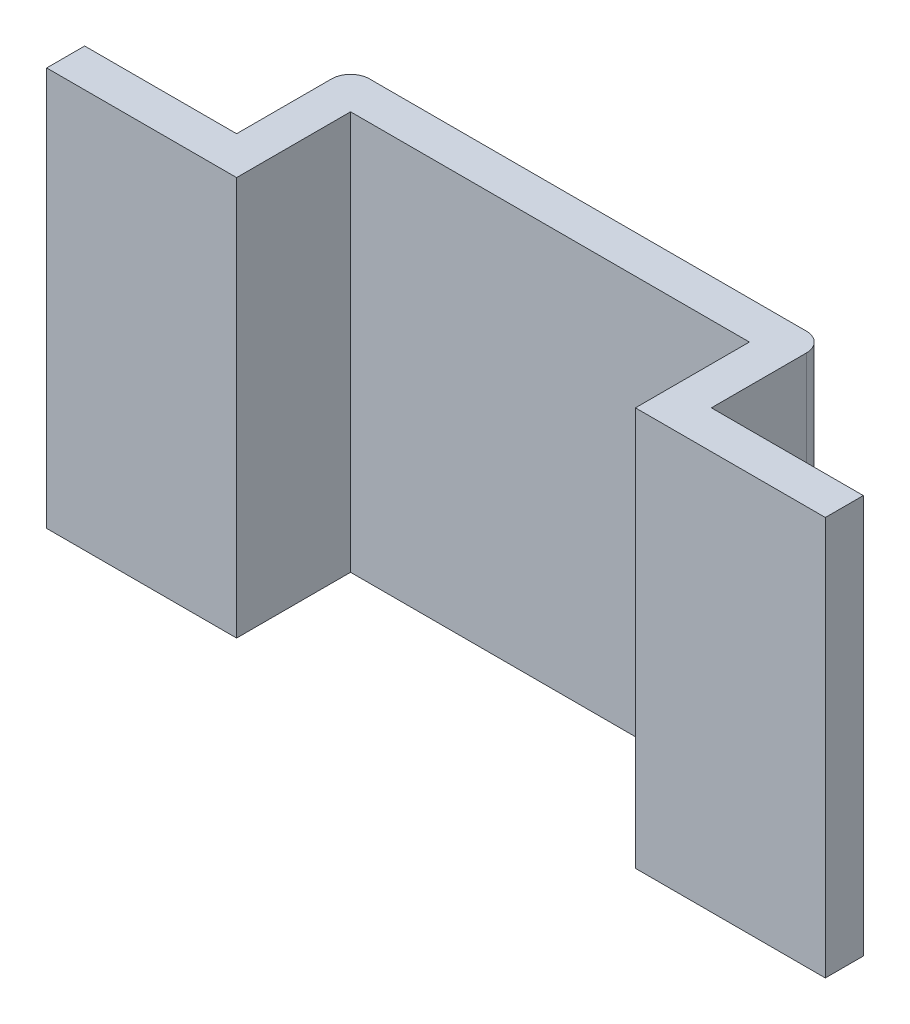
ISO-10303-21;
HEADER;
FILE_DESCRIPTION(('STEP AP214'),'2;1');
FILE_NAME('part.step','',(''),(''),'','','');
FILE_SCHEMA(('AUTOMOTIVE_DESIGN { 1 0 10303 214 1 1 1 1 }'));
ENDSEC;
DATA;
#1=APPLICATION_CONTEXT('core data for automotive mechanical design processes');
#2=APPLICATION_PROTOCOL_DEFINITION('international standard','automotive_design',2000,#1);
#3=PRODUCT_CONTEXT('',#1,'mechanical');
#4=PRODUCT('Part','Part','',(#3));
#5=PRODUCT_RELATED_PRODUCT_CATEGORY('part','',(#4));
#6=PRODUCT_DEFINITION_FORMATION('','',#4);
#7=PRODUCT_DEFINITION_CONTEXT('part definition',#1,'design');
#8=PRODUCT_DEFINITION('design','',#6,#7);
#9=PRODUCT_DEFINITION_SHAPE('','',#8);
#10=(LENGTH_UNIT() NAMED_UNIT(*) SI_UNIT(.MILLI.,.METRE.));
#11=(NAMED_UNIT(*) PLANE_ANGLE_UNIT() SI_UNIT($,.RADIAN.));
#12=(NAMED_UNIT(*) SI_UNIT($,.STERADIAN.) SOLID_ANGLE_UNIT());
#13=UNCERTAINTY_MEASURE_WITH_UNIT(LENGTH_MEASURE(1.E-05),#10,'distance_accuracy_value','');
#14=(GEOMETRIC_REPRESENTATION_CONTEXT(3) GLOBAL_UNCERTAINTY_ASSIGNED_CONTEXT((#13)) GLOBAL_UNIT_ASSIGNED_CONTEXT((#10,
#11,#12)) REPRESENTATION_CONTEXT('',''));
#15=CARTESIAN_POINT('',(0.,0.,0.));
#16=DIRECTION('',(0.,0.,1.));
#17=DIRECTION('',(1.,0.,0.));
#18=AXIS2_PLACEMENT_3D('',#15,#16,#17);
#19=CARTESIAN_POINT('',(-10.5,21.,0.));
#20=DIRECTION('',(-1.,0.,0.));
#21=DIRECTION('',(0.,0.,1.));
#22=AXIS2_PLACEMENT_3D('',#19,#20,#21);
#23=PLANE('',#22);
#24=DIRECTION('',(0.,0.,-1.));
#25=VECTOR('',#24,1.);
#26=CARTESIAN_POINT('',(-10.5,0.,0.));
#27=LINE('',#26,#25);
#28=CARTESIAN_POINT('',(-10.5,0.,0.));
#29=VERTEX_POINT('',#28);
#30=CARTESIAN_POINT('',(-10.5,0.,-6.));
#31=VERTEX_POINT('',#30);
#32=EDGE_CURVE('E159',#29,#31,#27,.T.);
#33=ORIENTED_EDGE('',*,*,#32,.T.);
#34=DIRECTION('',(0.,-1.,0.));
#35=VECTOR('',#34,1.);
#36=CARTESIAN_POINT('',(-10.5,21.,-6.));
#37=LINE('',#36,#35);
#38=CARTESIAN_POINT('',(-10.5,21.,-6.));
#39=VERTEX_POINT('',#38);
#40=EDGE_CURVE('E141',#39,#31,#37,.T.);
#41=ORIENTED_EDGE('',*,*,#40,.F.);
#42=DIRECTION('',(0.,0.,-1.));
#43=VECTOR('',#42,1.);
#44=CARTESIAN_POINT('',(-10.5,21.,0.));
#45=LINE('',#44,#43);
#46=CARTESIAN_POINT('',(-10.5,21.,0.));
#47=VERTEX_POINT('',#46);
#48=EDGE_CURVE('E147',#47,#39,#45,.T.);
#49=ORIENTED_EDGE('',*,*,#48,.F.);
#50=DIRECTION('',(0.,-1.,0.));
#51=VECTOR('',#50,1.);
#52=CARTESIAN_POINT('',(-10.5,21.,0.));
#53=LINE('',#52,#51);
#54=EDGE_CURVE('E213',#47,#29,#53,.T.);
#55=ORIENTED_EDGE('',*,*,#54,.T.);
#56=EDGE_LOOP('',(#33,#41,#49,#55));
#57=FACE_BOUND('',#56,.T.);
#58=ADVANCED_FACE('F33',(#57),#23,.F.);
#59=CARTESIAN_POINT('',(-10.5,21.,-6.));
#60=DIRECTION('',(0.,0.,-1.));
#61=DIRECTION('',(-1.,0.,0.));
#62=AXIS2_PLACEMENT_3D('',#59,#60,#61);
#63=PLANE('',#62);
#64=DIRECTION('',(1.,0.,0.));
#65=VECTOR('',#64,1.);
#66=CARTESIAN_POINT('',(-10.5,0.,-6.));
#67=LINE('',#66,#65);
#68=CARTESIAN_POINT('',(10.5,0.,-6.));
#69=VERTEX_POINT('',#68);
#70=EDGE_CURVE('E244',#31,#69,#67,.T.);
#71=ORIENTED_EDGE('',*,*,#70,.T.);
#72=DIRECTION('',(0.,-1.,0.));
#73=VECTOR('',#72,1.);
#74=CARTESIAN_POINT('',(10.5,21.,-6.));
#75=LINE('',#74,#73);
#76=CARTESIAN_POINT('',(10.5,21.,-6.));
#77=VERTEX_POINT('',#76);
#78=EDGE_CURVE('E144',#77,#69,#75,.T.);
#79=ORIENTED_EDGE('',*,*,#78,.F.);
#80=DIRECTION('',(1.,0.,0.));
#81=VECTOR('',#80,1.);
#82=CARTESIAN_POINT('',(-10.5,21.,-6.));
#83=LINE('',#82,#81);
#84=EDGE_CURVE('E137',#39,#77,#83,.T.);
#85=ORIENTED_EDGE('',*,*,#84,.F.);
#86=ORIENTED_EDGE('',*,*,#40,.T.);
#87=EDGE_LOOP('',(#71,#79,#85,#86));
#88=FACE_BOUND('',#87,.T.);
#89=ADVANCED_FACE('F139',(#88),#63,.F.);
#90=CARTESIAN_POINT('',(10.5,21.,0.));
#91=DIRECTION('',(1.,0.,0.));
#92=DIRECTION('',(0.,0.,-1.));
#93=AXIS2_PLACEMENT_3D('',#90,#91,#92);
#94=PLANE('',#93);
#95=DIRECTION('',(0.,0.,1.));
#96=VECTOR('',#95,1.);
#97=CARTESIAN_POINT('',(10.5,0.,0.));
#98=LINE('',#97,#96);
#99=CARTESIAN_POINT('',(10.5,0.,0.));
#100=VERTEX_POINT('',#99);
#101=EDGE_CURVE('E242',#69,#100,#98,.T.);
#102=ORIENTED_EDGE('',*,*,#101,.T.);
#103=DIRECTION('',(0.,-1.,0.));
#104=VECTOR('',#103,1.);
#105=CARTESIAN_POINT('',(10.5,21.,0.));
#106=LINE('',#105,#104);
#107=CARTESIAN_POINT('',(10.5,21.,0.));
#108=VERTEX_POINT('',#107);
#109=EDGE_CURVE('E164',#108,#100,#106,.T.);
#110=ORIENTED_EDGE('',*,*,#109,.F.);
#111=DIRECTION('',(0.,0.,1.));
#112=VECTOR('',#111,1.);
#113=CARTESIAN_POINT('',(10.5,21.,0.));
#114=LINE('',#113,#112);
#115=EDGE_CURVE('E146',#77,#108,#114,.T.);
#116=ORIENTED_EDGE('',*,*,#115,.F.);
#117=ORIENTED_EDGE('',*,*,#78,.T.);
#118=EDGE_LOOP('',(#102,#110,#116,#117));
#119=FACE_BOUND('',#118,.T.);
#120=ADVANCED_FACE('F261',(#119),#94,.F.);
#121=CARTESIAN_POINT('',(10.5,21.,0.));
#122=DIRECTION('',(0.,0.,-1.));
#123=DIRECTION('',(-1.,0.,0.));
#124=AXIS2_PLACEMENT_3D('',#121,#122,#123);
#125=PLANE('',#124);
#126=DIRECTION('',(1.,0.,0.));
#127=VECTOR('',#126,1.);
#128=CARTESIAN_POINT('',(10.5,0.,0.));
#129=LINE('',#128,#127);
#130=CARTESIAN_POINT('',(20.5,0.,0.));
#131=VERTEX_POINT('',#130);
#132=EDGE_CURVE('E237',#100,#131,#129,.T.);
#133=ORIENTED_EDGE('',*,*,#132,.T.);
#134=DIRECTION('',(0.,-1.,0.));
#135=VECTOR('',#134,1.);
#136=CARTESIAN_POINT('',(20.5,21.,0.));
#137=LINE('',#136,#135);
#138=CARTESIAN_POINT('',(20.5,21.,0.));
#139=VERTEX_POINT('',#138);
#140=EDGE_CURVE('E228',#139,#131,#137,.T.);
#141=ORIENTED_EDGE('',*,*,#140,.F.);
#142=DIRECTION('',(1.,0.,0.));
#143=VECTOR('',#142,1.);
#144=CARTESIAN_POINT('',(10.5,21.,0.));
#145=LINE('',#144,#143);
#146=EDGE_CURVE('E238',#108,#139,#145,.T.);
#147=ORIENTED_EDGE('',*,*,#146,.F.);
#148=ORIENTED_EDGE('',*,*,#109,.T.);
#149=EDGE_LOOP('',(#133,#141,#147,#148));
#150=FACE_BOUND('',#149,.T.);
#151=ADVANCED_FACE('F235',(#150),#125,.F.);
#152=CARTESIAN_POINT('',(20.5,21.,0.));
#153=DIRECTION('',(-1.,0.,0.));
#154=DIRECTION('',(0.,0.,1.));
#155=AXIS2_PLACEMENT_3D('',#152,#153,#154);
#156=PLANE('',#155);
#157=DIRECTION('',(0.,0.,-1.));
#158=VECTOR('',#157,1.);
#159=CARTESIAN_POINT('',(20.5,0.,0.));
#160=LINE('',#159,#158);
#161=CARTESIAN_POINT('',(20.5,0.,-2.));
#162=VERTEX_POINT('',#161);
#163=EDGE_CURVE('E203',#131,#162,#160,.T.);
#164=ORIENTED_EDGE('',*,*,#163,.T.);
#165=DIRECTION('',(0.,-1.,0.));
#166=VECTOR('',#165,1.);
#167=CARTESIAN_POINT('',(20.5,21.,-2.));
#168=LINE('',#167,#166);
#169=CARTESIAN_POINT('',(20.5,21.,-2.));
#170=VERTEX_POINT('',#169);
#171=EDGE_CURVE('E225',#170,#162,#168,.T.);
#172=ORIENTED_EDGE('',*,*,#171,.F.);
#173=DIRECTION('',(0.,0.,-1.));
#174=VECTOR('',#173,1.);
#175=CARTESIAN_POINT('',(20.5,21.,0.));
#176=LINE('',#175,#174);
#177=EDGE_CURVE('E258',#139,#170,#176,.T.);
#178=ORIENTED_EDGE('',*,*,#177,.F.);
#179=ORIENTED_EDGE('',*,*,#140,.T.);
#180=EDGE_LOOP('',(#164,#172,#178,#179));
#181=FACE_BOUND('',#180,.T.);
#182=ADVANCED_FACE('F268',(#181),#156,.F.);
#183=CARTESIAN_POINT('',(20.5,21.,-2.));
#184=DIRECTION('',(0.,0.,1.));
#185=DIRECTION('',(1.,0.,0.));
#186=AXIS2_PLACEMENT_3D('',#183,#184,#185);
#187=PLANE('',#186);
#188=DIRECTION('',(-1.,0.,0.));
#189=VECTOR('',#188,1.);
#190=CARTESIAN_POINT('',(20.5,0.,-2.));
#191=LINE('',#190,#189);
#192=CARTESIAN_POINT('',(12.5,0.,-2.));
#193=VERTEX_POINT('',#192);
#194=EDGE_CURVE('E199',#162,#193,#191,.T.);
#195=ORIENTED_EDGE('',*,*,#194,.T.);
#196=DIRECTION('',(0.,-1.,0.));
#197=VECTOR('',#196,1.);
#198=CARTESIAN_POINT('',(12.5,21.,-2.));
#199=LINE('',#198,#197);
#200=CARTESIAN_POINT('',(12.5,21.,-2.));
#201=VERTEX_POINT('',#200);
#202=EDGE_CURVE('E198',#201,#193,#199,.T.);
#203=ORIENTED_EDGE('',*,*,#202,.F.);
#204=DIRECTION('',(-1.,0.,0.));
#205=VECTOR('',#204,1.);
#206=CARTESIAN_POINT('',(20.5,21.,-2.));
#207=LINE('',#206,#205);
#208=EDGE_CURVE('E256',#170,#201,#207,.T.);
#209=ORIENTED_EDGE('',*,*,#208,.F.);
#210=ORIENTED_EDGE('',*,*,#171,.T.);
#211=EDGE_LOOP('',(#195,#203,#209,#210));
#212=FACE_BOUND('',#211,.T.);
#213=ADVANCED_FACE('F307',(#212),#187,.F.);
#214=CARTESIAN_POINT('',(12.5,21.,-2.));
#215=DIRECTION('',(-1.,0.,0.));
#216=DIRECTION('',(0.,0.,1.));
#217=AXIS2_PLACEMENT_3D('',#214,#215,#216);
#218=PLANE('',#217);
#219=DIRECTION('',(0.,0.,-1.));
#220=VECTOR('',#219,1.);
#221=CARTESIAN_POINT('',(12.5,0.,-2.));
#222=LINE('',#221,#220);
#223=CARTESIAN_POINT('',(12.5,0.,-7.));
#224=VERTEX_POINT('',#223);
#225=EDGE_CURVE('E193',#193,#224,#222,.T.);
#226=ORIENTED_EDGE('',*,*,#225,.T.);
#227=DIRECTION('',(0.,-1.,0.));
#228=VECTOR('',#227,1.);
#229=CARTESIAN_POINT('',(12.5,21.,-7.));
#230=LINE('',#229,#228);
#231=CARTESIAN_POINT('',(12.5,21.,-7.));
#232=VERTEX_POINT('',#231);
#233=EDGE_CURVE('E56',#224,#232,#230,.F.);
#234=ORIENTED_EDGE('',*,*,#233,.T.);
#235=DIRECTION('',(0.,0.,-1.));
#236=VECTOR('',#235,1.);
#237=CARTESIAN_POINT('',(12.5,21.,-2.));
#238=LINE('',#237,#236);
#239=EDGE_CURVE('E178',#201,#232,#238,.T.);
#240=ORIENTED_EDGE('',*,*,#239,.F.);
#241=ORIENTED_EDGE('',*,*,#202,.T.);
#242=EDGE_LOOP('',(#226,#234,#240,#241));
#243=FACE_BOUND('',#242,.T.);
#244=ADVANCED_FACE('F196',(#243),#218,.F.);
#245=CARTESIAN_POINT('',(-12.5,21.,-8.));
#246=DIRECTION('',(0.,0.,1.));
#247=DIRECTION('',(1.,0.,0.));
#248=AXIS2_PLACEMENT_3D('',#245,#246,#247);
#249=PLANE('',#248);
#250=DIRECTION('',(-1.,0.,0.));
#251=VECTOR('',#250,1.);
#252=CARTESIAN_POINT('',(-12.5,21.,-8.));
#253=LINE('',#252,#251);
#254=CARTESIAN_POINT('',(11.5,21.,-8.));
#255=VERTEX_POINT('',#254);
#256=CARTESIAN_POINT('',(-11.5,21.,-8.));
#257=VERTEX_POINT('',#256);
#258=EDGE_CURVE('E177',#255,#257,#253,.T.);
#259=ORIENTED_EDGE('',*,*,#258,.F.);
#260=DIRECTION('',(0.,-1.,0.));
#261=VECTOR('',#260,1.);
#262=CARTESIAN_POINT('',(11.5,21.,-8.));
#263=LINE('',#262,#261);
#264=CARTESIAN_POINT('',(11.5,0.,-8.));
#265=VERTEX_POINT('',#264);
#266=EDGE_CURVE('E162',#255,#265,#263,.T.);
#267=ORIENTED_EDGE('',*,*,#266,.T.);
#268=DIRECTION('',(-1.,0.,0.));
#269=VECTOR('',#268,1.);
#270=CARTESIAN_POINT('',(-12.5,0.,-8.));
#271=LINE('',#270,#269);
#272=CARTESIAN_POINT('',(-11.5,0.,-8.));
#273=VERTEX_POINT('',#272);
#274=EDGE_CURVE('E194',#265,#273,#271,.T.);
#275=ORIENTED_EDGE('',*,*,#274,.T.);
#276=DIRECTION('',(0.,-1.,0.));
#277=VECTOR('',#276,1.);
#278=CARTESIAN_POINT('',(-11.5,21.,-8.));
#279=LINE('',#278,#277);
#280=EDGE_CURVE('E160',#273,#257,#279,.F.);
#281=ORIENTED_EDGE('',*,*,#280,.T.);
#282=EDGE_LOOP('',(#259,#267,#275,#281));
#283=FACE_BOUND('',#282,.T.);
#284=ADVANCED_FACE('F182',(#283),#249,.F.);
#285=CARTESIAN_POINT('',(-12.5,21.,-2.));
#286=DIRECTION('',(1.,0.,0.));
#287=DIRECTION('',(0.,0.,-1.));
#288=AXIS2_PLACEMENT_3D('',#285,#286,#287);
#289=PLANE('',#288);
#290=DIRECTION('',(0.,0.,1.));
#291=VECTOR('',#290,1.);
#292=CARTESIAN_POINT('',(-12.5,21.,-2.));
#293=LINE('',#292,#291);
#294=CARTESIAN_POINT('',(-12.5,21.,-7.));
#295=VERTEX_POINT('',#294);
#296=CARTESIAN_POINT('',(-12.5,21.,-2.));
#297=VERTEX_POINT('',#296);
#298=EDGE_CURVE('E186',#295,#297,#293,.T.);
#299=ORIENTED_EDGE('',*,*,#298,.F.);
#300=DIRECTION('',(0.,-1.,0.));
#301=VECTOR('',#300,1.);
#302=CARTESIAN_POINT('',(-12.5,21.,-7.));
#303=LINE('',#302,#301);
#304=CARTESIAN_POINT('',(-12.5,0.,-7.));
#305=VERTEX_POINT('',#304);
#306=EDGE_CURVE('E11',#295,#305,#303,.T.);
#307=ORIENTED_EDGE('',*,*,#306,.T.);
#308=DIRECTION('',(0.,0.,1.));
#309=VECTOR('',#308,1.);
#310=CARTESIAN_POINT('',(-12.5,0.,-2.));
#311=LINE('',#310,#309);
#312=CARTESIAN_POINT('',(-12.5,0.,-2.));
#313=VERTEX_POINT('',#312);
#314=EDGE_CURVE('E201',#305,#313,#311,.T.);
#315=ORIENTED_EDGE('',*,*,#314,.T.);
#316=DIRECTION('',(0.,-1.,0.));
#317=VECTOR('',#316,1.);
#318=CARTESIAN_POINT('',(-12.5,21.,-2.));
#319=LINE('',#318,#317);
#320=EDGE_CURVE('E221',#297,#313,#319,.T.);
#321=ORIENTED_EDGE('',*,*,#320,.F.);
#322=EDGE_LOOP('',(#299,#307,#315,#321));
#323=FACE_BOUND('',#322,.T.);
#324=ADVANCED_FACE('F298',(#323),#289,.F.);
#325=CARTESIAN_POINT('',(-20.5,21.,-2.));
#326=DIRECTION('',(0.,0.,1.));
#327=DIRECTION('',(1.,0.,0.));
#328=AXIS2_PLACEMENT_3D('',#325,#326,#327);
#329=PLANE('',#328);
#330=DIRECTION('',(-1.,0.,0.));
#331=VECTOR('',#330,1.);
#332=CARTESIAN_POINT('',(-20.5,0.,-2.));
#333=LINE('',#332,#331);
#334=CARTESIAN_POINT('',(-20.5,0.,-2.));
#335=VERTEX_POINT('',#334);
#336=EDGE_CURVE('E208',#313,#335,#333,.T.);
#337=ORIENTED_EDGE('',*,*,#336,.T.);
#338=DIRECTION('',(0.,-1.,0.));
#339=VECTOR('',#338,1.);
#340=CARTESIAN_POINT('',(-20.5,21.,-2.));
#341=LINE('',#340,#339);
#342=CARTESIAN_POINT('',(-20.5,21.,-2.));
#343=VERTEX_POINT('',#342);
#344=EDGE_CURVE('E218',#343,#335,#341,.T.);
#345=ORIENTED_EDGE('',*,*,#344,.F.);
#346=DIRECTION('',(-1.,0.,0.));
#347=VECTOR('',#346,1.);
#348=CARTESIAN_POINT('',(-20.5,21.,-2.));
#349=LINE('',#348,#347);
#350=EDGE_CURVE('E252',#297,#343,#349,.T.);
#351=ORIENTED_EDGE('',*,*,#350,.F.);
#352=ORIENTED_EDGE('',*,*,#320,.T.);
#353=EDGE_LOOP('',(#337,#345,#351,#352));
#354=FACE_BOUND('',#353,.T.);
#355=ADVANCED_FACE('F294',(#354),#329,.F.);
#356=CARTESIAN_POINT('',(-20.5,21.,0.));
#357=DIRECTION('',(1.,0.,0.));
#358=DIRECTION('',(0.,0.,-1.));
#359=AXIS2_PLACEMENT_3D('',#356,#357,#358);
#360=PLANE('',#359);
#361=DIRECTION('',(0.,0.,1.));
#362=VECTOR('',#361,1.);
#363=CARTESIAN_POINT('',(-20.5,0.,0.));
#364=LINE('',#363,#362);
#365=CARTESIAN_POINT('',(-20.5,0.,0.));
#366=VERTEX_POINT('',#365);
#367=EDGE_CURVE('E210',#335,#366,#364,.T.);
#368=ORIENTED_EDGE('',*,*,#367,.T.);
#369=DIRECTION('',(0.,-1.,0.));
#370=VECTOR('',#369,1.);
#371=CARTESIAN_POINT('',(-20.5,21.,0.));
#372=LINE('',#371,#370);
#373=CARTESIAN_POINT('',(-20.5,21.,0.));
#374=VERTEX_POINT('',#373);
#375=EDGE_CURVE('E215',#374,#366,#372,.T.);
#376=ORIENTED_EDGE('',*,*,#375,.F.);
#377=DIRECTION('',(0.,0.,1.));
#378=VECTOR('',#377,1.);
#379=CARTESIAN_POINT('',(-20.5,21.,0.));
#380=LINE('',#379,#378);
#381=EDGE_CURVE('E250',#343,#374,#380,.T.);
#382=ORIENTED_EDGE('',*,*,#381,.F.);
#383=ORIENTED_EDGE('',*,*,#344,.T.);
#384=EDGE_LOOP('',(#368,#376,#382,#383));
#385=FACE_BOUND('',#384,.T.);
#386=ADVANCED_FACE('F290',(#385),#360,.F.);
#387=CARTESIAN_POINT('',(-10.5,21.,0.));
#388=DIRECTION('',(0.,0.,-1.));
#389=DIRECTION('',(-1.,0.,0.));
#390=AXIS2_PLACEMENT_3D('',#387,#388,#389);
#391=PLANE('',#390);
#392=DIRECTION('',(1.,0.,0.));
#393=VECTOR('',#392,1.);
#394=CARTESIAN_POINT('',(-10.5,0.,0.));
#395=LINE('',#394,#393);
#396=EDGE_CURVE('E156',#366,#29,#395,.T.);
#397=ORIENTED_EDGE('',*,*,#396,.T.);
#398=ORIENTED_EDGE('',*,*,#54,.F.);
#399=DIRECTION('',(1.,0.,0.));
#400=VECTOR('',#399,1.);
#401=CARTESIAN_POINT('',(-10.5,21.,0.));
#402=LINE('',#401,#400);
#403=EDGE_CURVE('E152',#374,#47,#402,.T.);
#404=ORIENTED_EDGE('',*,*,#403,.F.);
#405=ORIENTED_EDGE('',*,*,#375,.T.);
#406=EDGE_LOOP('',(#397,#398,#404,#405));
#407=FACE_BOUND('',#406,.T.);
#408=ADVANCED_FACE('F285',(#407),#391,.F.);
#409=CARTESIAN_POINT('',(0.,21.,0.));
#410=DIRECTION('',(0.,-1.,0.));
#411=DIRECTION('',(0.,0.,-1.));
#412=AXIS2_PLACEMENT_3D('',#409,#410,#411);
#413=PLANE('',#412);
#414=ORIENTED_EDGE('',*,*,#239,.T.);
#415=CARTESIAN_POINT('',(11.5,21.,-7.));
#416=DIRECTION('',(0.,-1.,0.));
#417=DIRECTION('',(0.,0.,-1.));
#418=AXIS2_PLACEMENT_3D('',#415,#416,#417);
#419=CIRCLE('',#418,1.);
#420=EDGE_CURVE('E41',#232,#255,#419,.F.);
#421=ORIENTED_EDGE('',*,*,#420,.T.);
#422=ORIENTED_EDGE('',*,*,#258,.T.);
#423=CARTESIAN_POINT('',(-11.5,21.,-7.));
#424=DIRECTION('',(0.,-1.,0.));
#425=DIRECTION('',(0.,0.,-1.));
#426=AXIS2_PLACEMENT_3D('',#423,#424,#425);
#427=CIRCLE('',#426,1.);
#428=EDGE_CURVE('E48',#257,#295,#427,.F.);
#429=ORIENTED_EDGE('',*,*,#428,.T.);
#430=ORIENTED_EDGE('',*,*,#298,.T.);
#431=ORIENTED_EDGE('',*,*,#350,.T.);
#432=ORIENTED_EDGE('',*,*,#381,.T.);
#433=ORIENTED_EDGE('',*,*,#403,.T.);
#434=ORIENTED_EDGE('',*,*,#48,.T.);
#435=ORIENTED_EDGE('',*,*,#84,.T.);
#436=ORIENTED_EDGE('',*,*,#115,.T.);
#437=ORIENTED_EDGE('',*,*,#146,.T.);
#438=ORIENTED_EDGE('',*,*,#177,.T.);
#439=ORIENTED_EDGE('',*,*,#208,.T.);
#440=EDGE_LOOP('',(#414,#421,#422,#429,#430,#431,#432,#433,#434,#435,#436,#437,#438,#439));
#441=FACE_BOUND('',#440,.T.);
#442=ADVANCED_FACE('F150',(#441),#413,.F.);
#443=CARTESIAN_POINT('',(0.,0.,0.));
#444=DIRECTION('',(0.,-1.,0.));
#445=DIRECTION('',(0.,0.,-1.));
#446=AXIS2_PLACEMENT_3D('',#443,#444,#445);
#447=PLANE('',#446);
#448=ORIENTED_EDGE('',*,*,#274,.F.);
#449=CARTESIAN_POINT('',(11.5,0.,-7.));
#450=DIRECTION('',(0.,-1.,0.));
#451=DIRECTION('',(0.,0.,-1.));
#452=AXIS2_PLACEMENT_3D('',#449,#450,#451);
#453=CIRCLE('',#452,1.);
#454=EDGE_CURVE('E172',#265,#224,#453,.T.);
#455=ORIENTED_EDGE('',*,*,#454,.T.);
#456=ORIENTED_EDGE('',*,*,#225,.F.);
#457=ORIENTED_EDGE('',*,*,#194,.F.);
#458=ORIENTED_EDGE('',*,*,#163,.F.);
#459=ORIENTED_EDGE('',*,*,#132,.F.);
#460=ORIENTED_EDGE('',*,*,#101,.F.);
#461=ORIENTED_EDGE('',*,*,#70,.F.);
#462=ORIENTED_EDGE('',*,*,#32,.F.);
#463=ORIENTED_EDGE('',*,*,#396,.F.);
#464=ORIENTED_EDGE('',*,*,#367,.F.);
#465=ORIENTED_EDGE('',*,*,#336,.F.);
#466=ORIENTED_EDGE('',*,*,#314,.F.);
#467=CARTESIAN_POINT('',(-11.5,0.,-7.));
#468=DIRECTION('',(0.,-1.,0.));
#469=DIRECTION('',(0.,0.,-1.));
#470=AXIS2_PLACEMENT_3D('',#467,#468,#469);
#471=CIRCLE('',#470,1.);
#472=EDGE_CURVE('E170',#305,#273,#471,.T.);
#473=ORIENTED_EDGE('',*,*,#472,.T.);
#474=EDGE_LOOP('',(#448,#455,#456,#457,#458,#459,#460,#461,#462,#463,#464,#465,#466,#473));
#475=FACE_BOUND('',#474,.T.);
#476=ADVANCED_FACE('F191',(#475),#447,.T.);
#477=CARTESIAN_POINT('',(11.5,21.,-7.));
#478=DIRECTION('',(0.,-1.,0.));
#479=DIRECTION('',(0.,0.,-1.));
#480=AXIS2_PLACEMENT_3D('',#477,#478,#479);
#481=CYLINDRICAL_SURFACE('',#480,1.);
#482=ORIENTED_EDGE('',*,*,#420,.F.);
#483=ORIENTED_EDGE('',*,*,#233,.F.);
#484=ORIENTED_EDGE('',*,*,#454,.F.);
#485=ORIENTED_EDGE('',*,*,#266,.F.);
#486=EDGE_LOOP('',(#482,#483,#484,#485));
#487=FACE_BOUND('',#486,.T.);
#488=ADVANCED_FACE('F188',(#487),#481,.T.);
#489=CARTESIAN_POINT('',(-11.5,21.,-7.));
#490=DIRECTION('',(0.,-1.,0.));
#491=DIRECTION('',(0.,0.,-1.));
#492=AXIS2_PLACEMENT_3D('',#489,#490,#491);
#493=CYLINDRICAL_SURFACE('',#492,1.);
#494=ORIENTED_EDGE('',*,*,#428,.F.);
#495=ORIENTED_EDGE('',*,*,#280,.F.);
#496=ORIENTED_EDGE('',*,*,#472,.F.);
#497=ORIENTED_EDGE('',*,*,#306,.F.);
#498=EDGE_LOOP('',(#494,#495,#496,#497));
#499=FACE_BOUND('',#498,.T.);
#500=ADVANCED_FACE('F35',(#499),#493,.T.);
#501=CLOSED_SHELL('',(#58,#89,#120,#151,#182,#213,#244,#284,#324,#355,#386,#408,#442,#476,#488,#500));
#502=MANIFOLD_SOLID_BREP('B2',#501);
#503=ADVANCED_BREP_SHAPE_REPRESENTATION('',(#18,#502),#14);
#504=SHAPE_DEFINITION_REPRESENTATION(#9,#503);
ENDSEC;
END-ISO-10303-21;
